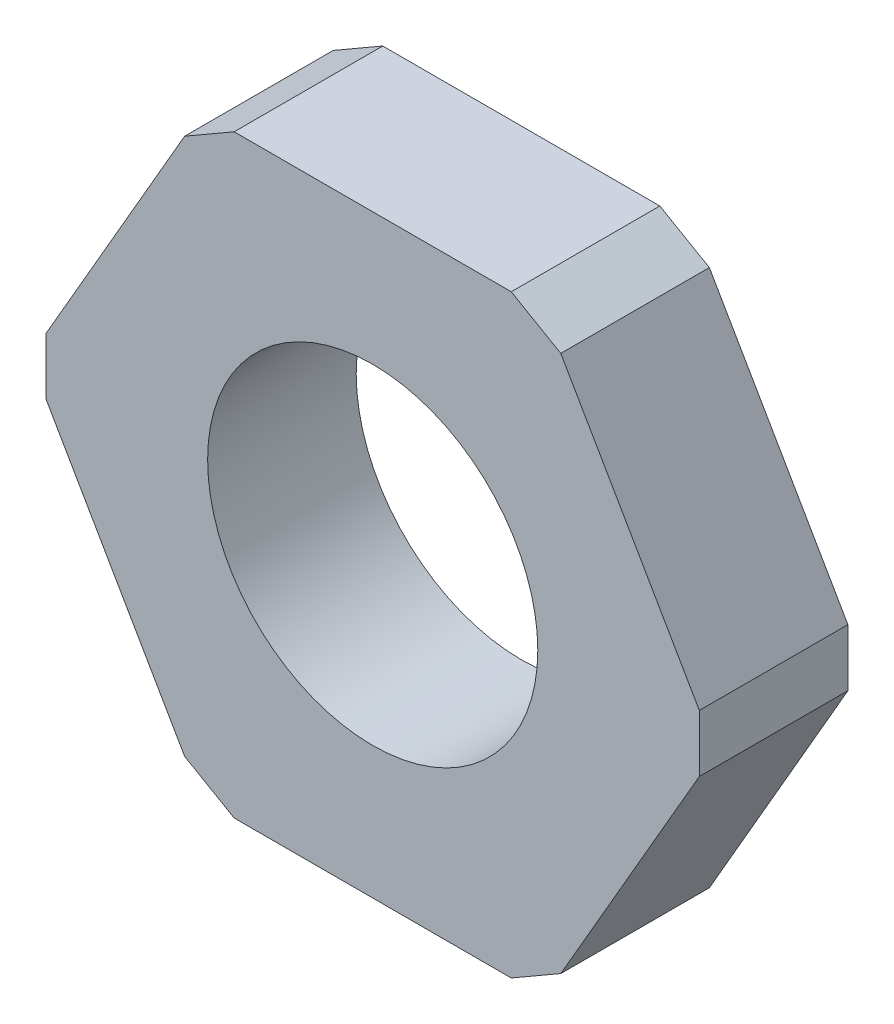
ISO-10303-21;
HEADER;
FILE_DESCRIPTION(('STEP AP214'),'2;1');
FILE_NAME('part.step','',(''),(''),'','','');
FILE_SCHEMA(('AUTOMOTIVE_DESIGN { 1 0 10303 214 1 1 1 1 }'));
ENDSEC;
DATA;
#1=APPLICATION_CONTEXT('core data for automotive mechanical design processes');
#2=APPLICATION_PROTOCOL_DEFINITION('international standard','automotive_design',2000,#1);
#3=PRODUCT_CONTEXT('',#1,'mechanical');
#4=PRODUCT('Part','Part','',(#3));
#5=PRODUCT_RELATED_PRODUCT_CATEGORY('part','',(#4));
#6=PRODUCT_DEFINITION_FORMATION('','',#4);
#7=PRODUCT_DEFINITION_CONTEXT('part definition',#1,'design');
#8=PRODUCT_DEFINITION('design','',#6,#7);
#9=PRODUCT_DEFINITION_SHAPE('','',#8);
#10=(LENGTH_UNIT() NAMED_UNIT(*) SI_UNIT(.MILLI.,.METRE.));
#11=(NAMED_UNIT(*) PLANE_ANGLE_UNIT() SI_UNIT($,.RADIAN.));
#12=(NAMED_UNIT(*) SI_UNIT($,.STERADIAN.) SOLID_ANGLE_UNIT());
#13=UNCERTAINTY_MEASURE_WITH_UNIT(LENGTH_MEASURE(1.E-05),#10,'distance_accuracy_value','');
#14=(GEOMETRIC_REPRESENTATION_CONTEXT(3) GLOBAL_UNCERTAINTY_ASSIGNED_CONTEXT((#13)) GLOBAL_UNIT_ASSIGNED_CONTEXT((#10,
#11,#12)) REPRESENTATION_CONTEXT('',''));
#15=CARTESIAN_POINT('',(0.,0.,0.));
#16=DIRECTION('',(0.,0.,1.));
#17=DIRECTION('',(1.,0.,0.));
#18=AXIS2_PLACEMENT_3D('',#15,#16,#17);
#19=CARTESIAN_POINT('',(0.,0.,4.5));
#20=DIRECTION('',(0.,0.,1.));
#21=DIRECTION('',(1.,0.,0.));
#22=AXIS2_PLACEMENT_3D('',#19,#20,#21);
#23=PLANE('',#22);
#24=DIRECTION('',(-0.866025403784439,-0.5,0.));
#25=VECTOR('',#24,1.);
#26=CARTESIAN_POINT('',(-92.0370616125619,29.2,4.5));
#27=LINE('',#26,#25);
#28=CARTESIAN_POINT('',(-92.0370616125619,29.2,4.5));
#29=VERTEX_POINT('',#28);
#30=CARTESIAN_POINT('',(-93.5370616125619,28.3339745962156,4.5));
#31=VERTEX_POINT('',#30);
#32=EDGE_CURVE('E176',#29,#31,#27,.T.);
#33=ORIENTED_EDGE('',*,*,#32,.T.);
#34=DIRECTION('',(-0.5,-0.866025403784439,0.));
#35=VECTOR('',#34,1.);
#36=CARTESIAN_POINT('',(-93.5370616125619,28.3339745962156,4.5));
#37=LINE('',#36,#35);
#38=CARTESIAN_POINT('',(-97.7332140352685,21.0660254037844,4.5));
#39=VERTEX_POINT('',#38);
#40=EDGE_CURVE('E104',#31,#39,#37,.T.);
#41=ORIENTED_EDGE('',*,*,#40,.T.);
#42=DIRECTION('',(0.,-1.,0.));
#43=VECTOR('',#42,1.);
#44=CARTESIAN_POINT('',(-97.7332140352685,21.0660254037844,4.5));
#45=LINE('',#44,#43);
#46=CARTESIAN_POINT('',(-97.7332140352685,19.3339745962156,4.5));
#47=VERTEX_POINT('',#46);
#48=EDGE_CURVE('E203',#39,#47,#45,.T.);
#49=ORIENTED_EDGE('',*,*,#48,.T.);
#50=DIRECTION('',(0.5,-0.866025403784439,0.));
#51=VECTOR('',#50,1.);
#52=CARTESIAN_POINT('',(-97.7332140352685,19.3339745962156,4.5));
#53=LINE('',#52,#51);
#54=CARTESIAN_POINT('',(-93.5370616125619,12.0660254037844,4.5));
#55=VERTEX_POINT('',#54);
#56=EDGE_CURVE('E222',#47,#55,#53,.T.);
#57=ORIENTED_EDGE('',*,*,#56,.T.);
#58=DIRECTION('',(0.866025403784439,-0.5,0.));
#59=VECTOR('',#58,1.);
#60=CARTESIAN_POINT('',(-93.5370616125619,12.0660254037844,4.5));
#61=LINE('',#60,#59);
#62=CARTESIAN_POINT('',(-92.0370616125619,11.2,4.5));
#63=VERTEX_POINT('',#62);
#64=EDGE_CURVE('E219',#55,#63,#61,.T.);
#65=ORIENTED_EDGE('',*,*,#64,.T.);
#66=DIRECTION('',(1.,0.,0.));
#67=VECTOR('',#66,1.);
#68=CARTESIAN_POINT('',(-92.0370616125619,11.2,4.5));
#69=LINE('',#68,#67);
#70=CARTESIAN_POINT('',(-83.6447567671486,11.2,4.5));
#71=VERTEX_POINT('',#70);
#72=EDGE_CURVE('E221',#63,#71,#69,.T.);
#73=ORIENTED_EDGE('',*,*,#72,.T.);
#74=DIRECTION('',(0.866025403784439,0.5,0.));
#75=VECTOR('',#74,1.);
#76=CARTESIAN_POINT('',(-83.6447567671486,11.2,4.5));
#77=LINE('',#76,#75);
#78=CARTESIAN_POINT('',(-82.1447567671486,12.0660254037844,4.5));
#79=VERTEX_POINT('',#78);
#80=EDGE_CURVE('E224',#71,#79,#77,.T.);
#81=ORIENTED_EDGE('',*,*,#80,.T.);
#82=DIRECTION('',(0.499999999999999,0.866025403784439,0.));
#83=VECTOR('',#82,1.);
#84=CARTESIAN_POINT('',(-82.1447567671486,12.0660254037844,4.5));
#85=LINE('',#84,#83);
#86=CARTESIAN_POINT('',(-77.948604344442,19.3339745962155,4.5));
#87=VERTEX_POINT('',#86);
#88=EDGE_CURVE('E230',#79,#87,#85,.T.);
#89=ORIENTED_EDGE('',*,*,#88,.T.);
#90=DIRECTION('',(0.,1.,0.));
#91=VECTOR('',#90,1.);
#92=CARTESIAN_POINT('',(-77.948604344442,19.3339745962155,4.5));
#93=LINE('',#92,#91);
#94=CARTESIAN_POINT('',(-77.948604344442,21.0660254037844,4.5));
#95=VERTEX_POINT('',#94);
#96=EDGE_CURVE('E135',#87,#95,#93,.T.);
#97=ORIENTED_EDGE('',*,*,#96,.T.);
#98=DIRECTION('',(-0.5,0.866025403784439,0.));
#99=VECTOR('',#98,1.);
#100=CARTESIAN_POINT('',(-77.948604344442,21.0660254037844,4.5));
#101=LINE('',#100,#99);
#102=CARTESIAN_POINT('',(-82.1447567671486,28.3339745962156,4.5));
#103=VERTEX_POINT('',#102);
#104=EDGE_CURVE('E129',#95,#103,#101,.T.);
#105=ORIENTED_EDGE('',*,*,#104,.T.);
#106=DIRECTION('',(-0.866025403784439,0.5,0.));
#107=VECTOR('',#106,1.);
#108=CARTESIAN_POINT('',(-82.1447567671486,28.3339745962156,4.5));
#109=LINE('',#108,#107);
#110=CARTESIAN_POINT('',(-83.6447567671486,29.2,4.5));
#111=VERTEX_POINT('',#110);
#112=EDGE_CURVE('E133',#103,#111,#109,.T.);
#113=ORIENTED_EDGE('',*,*,#112,.T.);
#114=DIRECTION('',(-1.,0.,0.));
#115=VECTOR('',#114,1.);
#116=CARTESIAN_POINT('',(-83.6447567671486,29.2,4.5));
#117=LINE('',#116,#115);
#118=EDGE_CURVE('E49',#111,#29,#117,.T.);
#119=ORIENTED_EDGE('',*,*,#118,.T.);
#120=EDGE_LOOP('',(#33,#41,#49,#57,#65,#73,#81,#89,#97,#105,#113,#119));
#121=FACE_BOUND('',#120,.T.);
#122=CARTESIAN_POINT('',(-87.8409091898553,20.2,4.5));
#123=DIRECTION('',(0.,0.,1.));
#124=DIRECTION('',(1.,0.,0.));
#125=AXIS2_PLACEMENT_3D('',#122,#123,#124);
#126=CIRCLE('',#125,5.);
#127=CARTESIAN_POINT('',(-82.8409091898553,20.2,4.5));
#128=VERTEX_POINT('',#127);
#129=EDGE_CURVE('E157',#128,#128,#126,.T.);
#130=ORIENTED_EDGE('',*,*,#129,.F.);
#131=EDGE_LOOP('',(#130));
#132=FACE_BOUND('',#131,.T.);
#133=ADVANCED_FACE('F32',(#121,#132),#23,.T.);
#134=CARTESIAN_POINT('',(0.,0.,0.));
#135=DIRECTION('',(0.,0.,1.));
#136=DIRECTION('',(1.,0.,0.));
#137=AXIS2_PLACEMENT_3D('',#134,#135,#136);
#138=PLANE('',#137);
#139=DIRECTION('',(-0.866025403784439,-0.5,0.));
#140=VECTOR('',#139,1.);
#141=CARTESIAN_POINT('',(-92.0370616125619,29.2,0.));
#142=LINE('',#141,#140);
#143=CARTESIAN_POINT('',(-92.0370616125619,29.2,0.));
#144=VERTEX_POINT('',#143);
#145=CARTESIAN_POINT('',(-93.5370616125619,28.3339745962156,0.));
#146=VERTEX_POINT('',#145);
#147=EDGE_CURVE('E153',#144,#146,#142,.T.);
#148=ORIENTED_EDGE('',*,*,#147,.F.);
#149=DIRECTION('',(-1.,0.,0.));
#150=VECTOR('',#149,1.);
#151=CARTESIAN_POINT('',(-83.6447567671486,29.2,0.));
#152=LINE('',#151,#150);
#153=CARTESIAN_POINT('',(-83.6447567671486,29.2,0.));
#154=VERTEX_POINT('',#153);
#155=EDGE_CURVE('E96',#154,#144,#152,.T.);
#156=ORIENTED_EDGE('',*,*,#155,.F.);
#157=DIRECTION('',(-0.866025403784439,0.5,0.));
#158=VECTOR('',#157,1.);
#159=CARTESIAN_POINT('',(-82.1447567671486,28.3339745962156,0.));
#160=LINE('',#159,#158);
#161=CARTESIAN_POINT('',(-82.1447567671486,28.3339745962156,0.));
#162=VERTEX_POINT('',#161);
#163=EDGE_CURVE('E90',#162,#154,#160,.T.);
#164=ORIENTED_EDGE('',*,*,#163,.F.);
#165=DIRECTION('',(-0.5,0.866025403784439,0.));
#166=VECTOR('',#165,1.);
#167=CARTESIAN_POINT('',(-77.948604344442,21.0660254037844,0.));
#168=LINE('',#167,#166);
#169=CARTESIAN_POINT('',(-77.948604344442,21.0660254037844,0.));
#170=VERTEX_POINT('',#169);
#171=EDGE_CURVE('E143',#170,#162,#168,.T.);
#172=ORIENTED_EDGE('',*,*,#171,.F.);
#173=DIRECTION('',(0.,1.,0.));
#174=VECTOR('',#173,1.);
#175=CARTESIAN_POINT('',(-77.948604344442,19.3339745962155,0.));
#176=LINE('',#175,#174);
#177=CARTESIAN_POINT('',(-77.948604344442,19.3339745962155,0.));
#178=VERTEX_POINT('',#177);
#179=EDGE_CURVE('E171',#178,#170,#176,.T.);
#180=ORIENTED_EDGE('',*,*,#179,.F.);
#181=DIRECTION('',(0.499999999999999,0.866025403784439,0.));
#182=VECTOR('',#181,1.);
#183=CARTESIAN_POINT('',(-82.1447567671486,12.0660254037844,0.));
#184=LINE('',#183,#182);
#185=CARTESIAN_POINT('',(-82.1447567671486,12.0660254037844,0.));
#186=VERTEX_POINT('',#185);
#187=EDGE_CURVE('E169',#186,#178,#184,.T.);
#188=ORIENTED_EDGE('',*,*,#187,.F.);
#189=DIRECTION('',(0.866025403784439,0.5,0.));
#190=VECTOR('',#189,1.);
#191=CARTESIAN_POINT('',(-83.6447567671486,11.2,0.));
#192=LINE('',#191,#190);
#193=CARTESIAN_POINT('',(-83.6447567671486,11.2,0.));
#194=VERTEX_POINT('',#193);
#195=EDGE_CURVE('E167',#194,#186,#192,.T.);
#196=ORIENTED_EDGE('',*,*,#195,.F.);
#197=DIRECTION('',(1.,0.,0.));
#198=VECTOR('',#197,1.);
#199=CARTESIAN_POINT('',(-92.0370616125619,11.2,0.));
#200=LINE('',#199,#198);
#201=CARTESIAN_POINT('',(-92.0370616125619,11.2,0.));
#202=VERTEX_POINT('',#201);
#203=EDGE_CURVE('E165',#202,#194,#200,.T.);
#204=ORIENTED_EDGE('',*,*,#203,.F.);
#205=DIRECTION('',(0.866025403784439,-0.5,0.));
#206=VECTOR('',#205,1.);
#207=CARTESIAN_POINT('',(-93.5370616125619,12.0660254037844,0.));
#208=LINE('',#207,#206);
#209=CARTESIAN_POINT('',(-93.5370616125619,12.0660254037844,0.));
#210=VERTEX_POINT('',#209);
#211=EDGE_CURVE('E163',#210,#202,#208,.T.);
#212=ORIENTED_EDGE('',*,*,#211,.F.);
#213=DIRECTION('',(0.5,-0.866025403784439,0.));
#214=VECTOR('',#213,1.);
#215=CARTESIAN_POINT('',(-97.7332140352685,19.3339745962156,0.));
#216=LINE('',#215,#214);
#217=CARTESIAN_POINT('',(-97.7332140352685,19.3339745962156,0.));
#218=VERTEX_POINT('',#217);
#219=EDGE_CURVE('E161',#218,#210,#216,.T.);
#220=ORIENTED_EDGE('',*,*,#219,.F.);
#221=DIRECTION('',(0.,-1.,0.));
#222=VECTOR('',#221,1.);
#223=CARTESIAN_POINT('',(-97.7332140352685,21.0660254037844,0.));
#224=LINE('',#223,#222);
#225=CARTESIAN_POINT('',(-97.7332140352685,21.0660254037844,0.));
#226=VERTEX_POINT('',#225);
#227=EDGE_CURVE('E159',#226,#218,#224,.T.);
#228=ORIENTED_EDGE('',*,*,#227,.F.);
#229=DIRECTION('',(-0.5,-0.866025403784439,0.));
#230=VECTOR('',#229,1.);
#231=CARTESIAN_POINT('',(-93.5370616125619,28.3339745962156,0.));
#232=LINE('',#231,#230);
#233=EDGE_CURVE('E156',#146,#226,#232,.T.);
#234=ORIENTED_EDGE('',*,*,#233,.F.);
#235=EDGE_LOOP('',(#148,#156,#164,#172,#180,#188,#196,#204,#212,#220,#228,#234));
#236=FACE_BOUND('',#235,.T.);
#237=CARTESIAN_POINT('',(-87.8409091898553,20.2,0.));
#238=DIRECTION('',(0.,0.,1.));
#239=DIRECTION('',(1.,0.,0.));
#240=AXIS2_PLACEMENT_3D('',#237,#238,#239);
#241=CIRCLE('',#240,5.);
#242=CARTESIAN_POINT('',(-82.8409091898553,20.2,0.));
#243=VERTEX_POINT('',#242);
#244=EDGE_CURVE('E377',#243,#243,#241,.T.);
#245=ORIENTED_EDGE('',*,*,#244,.T.);
#246=EDGE_LOOP('',(#245));
#247=FACE_BOUND('',#246,.T.);
#248=ADVANCED_FACE('F207',(#236,#247),#138,.F.);
#249=CARTESIAN_POINT('',(-92.0370616125619,29.2,4.5));
#250=DIRECTION('',(0.5,-0.866025403784439,0.));
#251=DIRECTION('',(0.866025403784439,0.5,0.));
#252=AXIS2_PLACEMENT_3D('',#249,#250,#251);
#253=PLANE('',#252);
#254=ORIENTED_EDGE('',*,*,#147,.T.);
#255=DIRECTION('',(0.,0.,-1.));
#256=VECTOR('',#255,1.);
#257=CARTESIAN_POINT('',(-93.5370616125619,28.3339745962156,4.5));
#258=LINE('',#257,#256);
#259=EDGE_CURVE('E11',#31,#146,#258,.T.);
#260=ORIENTED_EDGE('',*,*,#259,.F.);
#261=ORIENTED_EDGE('',*,*,#32,.F.);
#262=DIRECTION('',(0.,0.,-1.));
#263=VECTOR('',#262,1.);
#264=CARTESIAN_POINT('',(-92.0370616125619,29.2,4.5));
#265=LINE('',#264,#263);
#266=EDGE_CURVE('E149',#29,#144,#265,.T.);
#267=ORIENTED_EDGE('',*,*,#266,.T.);
#268=EDGE_LOOP('',(#254,#260,#261,#267));
#269=FACE_BOUND('',#268,.T.);
#270=ADVANCED_FACE('F34',(#269),#253,.F.);
#271=CARTESIAN_POINT('',(-93.5370616125619,28.3339745962156,4.5));
#272=DIRECTION('',(0.866025403784439,-0.5,0.));
#273=DIRECTION('',(0.5,0.866025403784439,0.));
#274=AXIS2_PLACEMENT_3D('',#271,#272,#273);
#275=PLANE('',#274);
#276=ORIENTED_EDGE('',*,*,#233,.T.);
#277=DIRECTION('',(0.,0.,-1.));
#278=VECTOR('',#277,1.);
#279=CARTESIAN_POINT('',(-97.7332140352685,21.0660254037844,4.5));
#280=LINE('',#279,#278);
#281=EDGE_CURVE('E41',#39,#226,#280,.T.);
#282=ORIENTED_EDGE('',*,*,#281,.F.);
#283=ORIENTED_EDGE('',*,*,#40,.F.);
#284=ORIENTED_EDGE('',*,*,#259,.T.);
#285=EDGE_LOOP('',(#276,#282,#283,#284));
#286=FACE_BOUND('',#285,.T.);
#287=ADVANCED_FACE('F264',(#286),#275,.F.);
#288=CARTESIAN_POINT('',(-97.7332140352685,21.0660254037844,4.5));
#289=DIRECTION('',(1.,0.,0.));
#290=DIRECTION('',(0.,0.,-1.));
#291=AXIS2_PLACEMENT_3D('',#288,#289,#290);
#292=PLANE('',#291);
#293=ORIENTED_EDGE('',*,*,#227,.T.);
#294=DIRECTION('',(0.,0.,-1.));
#295=VECTOR('',#294,1.);
#296=CARTESIAN_POINT('',(-97.7332140352685,19.3339745962156,4.5));
#297=LINE('',#296,#295);
#298=EDGE_CURVE('E195',#47,#218,#297,.T.);
#299=ORIENTED_EDGE('',*,*,#298,.F.);
#300=ORIENTED_EDGE('',*,*,#48,.F.);
#301=ORIENTED_EDGE('',*,*,#281,.T.);
#302=EDGE_LOOP('',(#293,#299,#300,#301));
#303=FACE_BOUND('',#302,.T.);
#304=ADVANCED_FACE('F201',(#303),#292,.F.);
#305=CARTESIAN_POINT('',(-97.7332140352685,19.3339745962156,4.5));
#306=DIRECTION('',(0.866025403784439,0.5,0.));
#307=DIRECTION('',(-0.5,0.866025403784439,0.));
#308=AXIS2_PLACEMENT_3D('',#305,#306,#307);
#309=PLANE('',#308);
#310=ORIENTED_EDGE('',*,*,#219,.T.);
#311=DIRECTION('',(0.,0.,-1.));
#312=VECTOR('',#311,1.);
#313=CARTESIAN_POINT('',(-93.5370616125619,12.0660254037844,4.5));
#314=LINE('',#313,#312);
#315=EDGE_CURVE('E192',#55,#210,#314,.T.);
#316=ORIENTED_EDGE('',*,*,#315,.F.);
#317=ORIENTED_EDGE('',*,*,#56,.F.);
#318=ORIENTED_EDGE('',*,*,#298,.T.);
#319=EDGE_LOOP('',(#310,#316,#317,#318));
#320=FACE_BOUND('',#319,.T.);
#321=ADVANCED_FACE('F213',(#320),#309,.F.);
#322=CARTESIAN_POINT('',(-93.5370616125619,12.0660254037844,4.5));
#323=DIRECTION('',(0.5,0.866025403784439,0.));
#324=DIRECTION('',(-0.866025403784439,0.5,0.));
#325=AXIS2_PLACEMENT_3D('',#322,#323,#324);
#326=PLANE('',#325);
#327=ORIENTED_EDGE('',*,*,#211,.T.);
#328=DIRECTION('',(0.,0.,-1.));
#329=VECTOR('',#328,1.);
#330=CARTESIAN_POINT('',(-92.0370616125619,11.2,4.5));
#331=LINE('',#330,#329);
#332=EDGE_CURVE('E189',#63,#202,#331,.T.);
#333=ORIENTED_EDGE('',*,*,#332,.F.);
#334=ORIENTED_EDGE('',*,*,#64,.F.);
#335=ORIENTED_EDGE('',*,*,#315,.T.);
#336=EDGE_LOOP('',(#327,#333,#334,#335));
#337=FACE_BOUND('',#336,.T.);
#338=ADVANCED_FACE('F217',(#337),#326,.F.);
#339=CARTESIAN_POINT('',(-92.0370616125619,11.2,4.5));
#340=DIRECTION('',(0.,1.,0.));
#341=DIRECTION('',(0.,0.,1.));
#342=AXIS2_PLACEMENT_3D('',#339,#340,#341);
#343=PLANE('',#342);
#344=ORIENTED_EDGE('',*,*,#203,.T.);
#345=DIRECTION('',(0.,0.,-1.));
#346=VECTOR('',#345,1.);
#347=CARTESIAN_POINT('',(-83.6447567671486,11.2,4.5));
#348=LINE('',#347,#346);
#349=EDGE_CURVE('E186',#71,#194,#348,.T.);
#350=ORIENTED_EDGE('',*,*,#349,.F.);
#351=ORIENTED_EDGE('',*,*,#72,.F.);
#352=ORIENTED_EDGE('',*,*,#332,.T.);
#353=EDGE_LOOP('',(#344,#350,#351,#352));
#354=FACE_BOUND('',#353,.T.);
#355=ADVANCED_FACE('F277',(#354),#343,.F.);
#356=CARTESIAN_POINT('',(-83.6447567671486,11.2,4.5));
#357=DIRECTION('',(-0.5,0.866025403784439,0.));
#358=DIRECTION('',(-0.866025403784439,-0.5,0.));
#359=AXIS2_PLACEMENT_3D('',#356,#357,#358);
#360=PLANE('',#359);
#361=ORIENTED_EDGE('',*,*,#195,.T.);
#362=DIRECTION('',(0.,0.,-1.));
#363=VECTOR('',#362,1.);
#364=CARTESIAN_POINT('',(-82.1447567671486,12.0660254037844,4.5));
#365=LINE('',#364,#363);
#366=EDGE_CURVE('E183',#79,#186,#365,.T.);
#367=ORIENTED_EDGE('',*,*,#366,.F.);
#368=ORIENTED_EDGE('',*,*,#80,.F.);
#369=ORIENTED_EDGE('',*,*,#349,.T.);
#370=EDGE_LOOP('',(#361,#367,#368,#369));
#371=FACE_BOUND('',#370,.T.);
#372=ADVANCED_FACE('F280',(#371),#360,.F.);
#373=CARTESIAN_POINT('',(-82.1447567671486,12.0660254037844,4.5));
#374=DIRECTION('',(-0.866025403784439,0.499999999999999,0.));
#375=DIRECTION('',(-0.499999999999999,-0.866025403784439,0.));
#376=AXIS2_PLACEMENT_3D('',#373,#374,#375);
#377=PLANE('',#376);
#378=ORIENTED_EDGE('',*,*,#187,.T.);
#379=DIRECTION('',(0.,0.,-1.));
#380=VECTOR('',#379,1.);
#381=CARTESIAN_POINT('',(-77.948604344442,19.3339745962155,4.5));
#382=LINE('',#381,#380);
#383=EDGE_CURVE('E180',#87,#178,#382,.T.);
#384=ORIENTED_EDGE('',*,*,#383,.F.);
#385=ORIENTED_EDGE('',*,*,#88,.F.);
#386=ORIENTED_EDGE('',*,*,#366,.T.);
#387=EDGE_LOOP('',(#378,#384,#385,#386));
#388=FACE_BOUND('',#387,.T.);
#389=ADVANCED_FACE('F236',(#388),#377,.F.);
#390=CARTESIAN_POINT('',(-77.948604344442,19.3339745962155,4.5));
#391=DIRECTION('',(-1.,0.,0.));
#392=DIRECTION('',(0.,0.,1.));
#393=AXIS2_PLACEMENT_3D('',#390,#391,#392);
#394=PLANE('',#393);
#395=ORIENTED_EDGE('',*,*,#179,.T.);
#396=DIRECTION('',(0.,0.,-1.));
#397=VECTOR('',#396,1.);
#398=CARTESIAN_POINT('',(-77.948604344442,21.0660254037844,4.5));
#399=LINE('',#398,#397);
#400=EDGE_CURVE('E144',#95,#170,#399,.T.);
#401=ORIENTED_EDGE('',*,*,#400,.F.);
#402=ORIENTED_EDGE('',*,*,#96,.F.);
#403=ORIENTED_EDGE('',*,*,#383,.T.);
#404=EDGE_LOOP('',(#395,#401,#402,#403));
#405=FACE_BOUND('',#404,.T.);
#406=ADVANCED_FACE('F240',(#405),#394,.F.);
#407=CARTESIAN_POINT('',(-77.948604344442,21.0660254037844,4.5));
#408=DIRECTION('',(-0.866025403784439,-0.5,0.));
#409=DIRECTION('',(0.5,-0.866025403784439,0.));
#410=AXIS2_PLACEMENT_3D('',#407,#408,#409);
#411=PLANE('',#410);
#412=ORIENTED_EDGE('',*,*,#171,.T.);
#413=DIRECTION('',(0.,0.,-1.));
#414=VECTOR('',#413,1.);
#415=CARTESIAN_POINT('',(-82.1447567671486,28.3339745962156,4.5));
#416=LINE('',#415,#414);
#417=EDGE_CURVE('E140',#103,#162,#416,.T.);
#418=ORIENTED_EDGE('',*,*,#417,.F.);
#419=ORIENTED_EDGE('',*,*,#104,.F.);
#420=ORIENTED_EDGE('',*,*,#400,.T.);
#421=EDGE_LOOP('',(#412,#418,#419,#420));
#422=FACE_BOUND('',#421,.T.);
#423=ADVANCED_FACE('F141',(#422),#411,.F.);
#424=CARTESIAN_POINT('',(-82.1447567671486,28.3339745962156,4.5));
#425=DIRECTION('',(-0.5,-0.866025403784439,0.));
#426=DIRECTION('',(0.866025403784439,-0.5,0.));
#427=AXIS2_PLACEMENT_3D('',#424,#425,#426);
#428=PLANE('',#427);
#429=ORIENTED_EDGE('',*,*,#163,.T.);
#430=DIRECTION('',(0.,0.,-1.));
#431=VECTOR('',#430,1.);
#432=CARTESIAN_POINT('',(-83.6447567671486,29.2,4.5));
#433=LINE('',#432,#431);
#434=EDGE_CURVE('E145',#111,#154,#433,.T.);
#435=ORIENTED_EDGE('',*,*,#434,.F.);
#436=ORIENTED_EDGE('',*,*,#112,.F.);
#437=ORIENTED_EDGE('',*,*,#417,.T.);
#438=EDGE_LOOP('',(#429,#435,#436,#437));
#439=FACE_BOUND('',#438,.T.);
#440=ADVANCED_FACE('F147',(#439),#428,.F.);
#441=CARTESIAN_POINT('',(-83.6447567671486,29.2,4.5));
#442=DIRECTION('',(0.,-1.,0.));
#443=DIRECTION('',(1.,0.,0.));
#444=AXIS2_PLACEMENT_3D('',#441,#442,#443);
#445=PLANE('',#444);
#446=ORIENTED_EDGE('',*,*,#155,.T.);
#447=ORIENTED_EDGE('',*,*,#266,.F.);
#448=ORIENTED_EDGE('',*,*,#118,.F.);
#449=ORIENTED_EDGE('',*,*,#434,.T.);
#450=EDGE_LOOP('',(#446,#447,#448,#449));
#451=FACE_BOUND('',#450,.T.);
#452=ADVANCED_FACE('F244',(#451),#445,.F.);
#453=CARTESIAN_POINT('',(-87.8409091898553,20.2,4.5));
#454=DIRECTION('',(0.,0.,-1.));
#455=DIRECTION('',(-1.,0.,0.));
#456=AXIS2_PLACEMENT_3D('',#453,#454,#455);
#457=CYLINDRICAL_SURFACE('',#456,5.);
#458=ORIENTED_EDGE('',*,*,#129,.T.);
#459=EDGE_LOOP('',(#458));
#460=FACE_BOUND('',#459,.T.);
#461=ORIENTED_EDGE('',*,*,#244,.F.);
#462=EDGE_LOOP('',(#461));
#463=FACE_BOUND('',#462,.T.);
#464=ADVANCED_FACE('F246',(#460,#463),#457,.F.);
#465=CLOSED_SHELL('',(#133,#248,#270,#287,#304,#321,#338,#355,#372,#389,#406,#423,#440,#452,#464));
#466=MANIFOLD_SOLID_BREP('B2',#465);
#467=ADVANCED_BREP_SHAPE_REPRESENTATION('',(#18,#466),#14);
#468=SHAPE_DEFINITION_REPRESENTATION(#9,#467);
ENDSEC;
END-ISO-10303-21;
